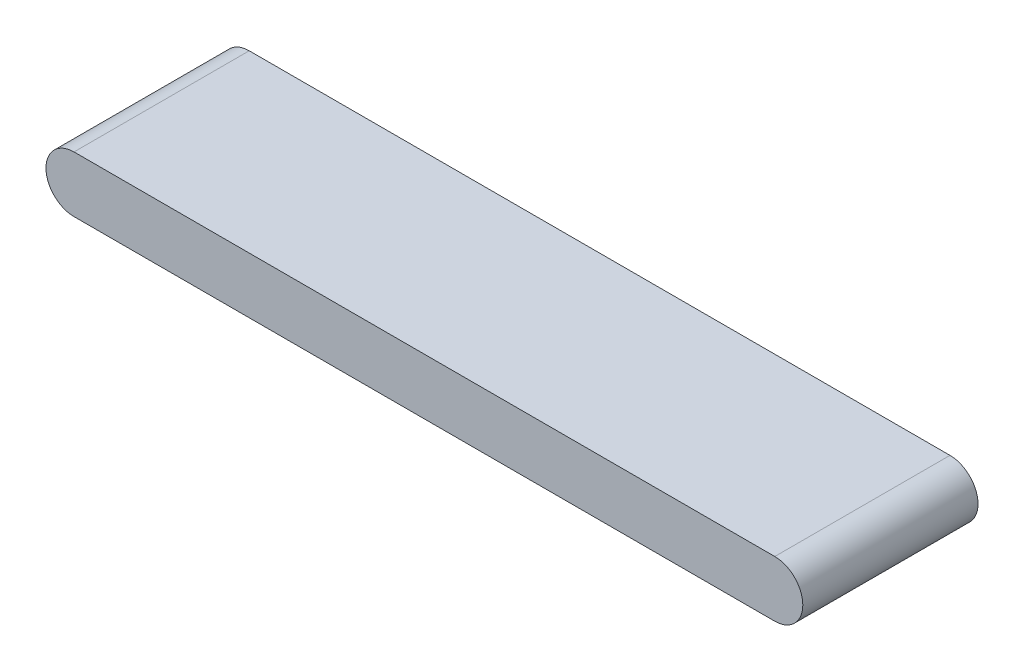
ISO-10303-21;
HEADER;
FILE_DESCRIPTION(('STEP AP214'),'2;1');
FILE_NAME('part.step','',(''),(''),'','','');
FILE_SCHEMA(('AUTOMOTIVE_DESIGN { 1 0 10303 214 1 1 1 1 }'));
ENDSEC;
DATA;
#1=APPLICATION_CONTEXT('core data for automotive mechanical design processes');
#2=APPLICATION_PROTOCOL_DEFINITION('international standard','automotive_design',2000,#1);
#3=PRODUCT_CONTEXT('',#1,'mechanical');
#4=PRODUCT('Part','Part','',(#3));
#5=PRODUCT_RELATED_PRODUCT_CATEGORY('part','',(#4));
#6=PRODUCT_DEFINITION_FORMATION('','',#4);
#7=PRODUCT_DEFINITION_CONTEXT('part definition',#1,'design');
#8=PRODUCT_DEFINITION('design','',#6,#7);
#9=PRODUCT_DEFINITION_SHAPE('','',#8);
#10=(LENGTH_UNIT() NAMED_UNIT(*) SI_UNIT(.MILLI.,.METRE.));
#11=(NAMED_UNIT(*) PLANE_ANGLE_UNIT() SI_UNIT($,.RADIAN.));
#12=(NAMED_UNIT(*) SI_UNIT($,.STERADIAN.) SOLID_ANGLE_UNIT());
#13=UNCERTAINTY_MEASURE_WITH_UNIT(LENGTH_MEASURE(1.E-05),#10,'distance_accuracy_value','');
#14=(GEOMETRIC_REPRESENTATION_CONTEXT(3) GLOBAL_UNCERTAINTY_ASSIGNED_CONTEXT((#13)) GLOBAL_UNIT_ASSIGNED_CONTEXT((#10,
#11,#12)) REPRESENTATION_CONTEXT('',''));
#15=CARTESIAN_POINT('',(0.,0.,0.));
#16=DIRECTION('',(0.,0.,1.));
#17=DIRECTION('',(1.,0.,0.));
#18=AXIS2_PLACEMENT_3D('',#15,#16,#17);
#19=CARTESIAN_POINT('',(-1000.,0.,250.));
#20=DIRECTION('',(0.,0.,-1.));
#21=DIRECTION('',(-1.,0.,0.));
#22=AXIS2_PLACEMENT_3D('',#19,#20,#21);
#23=CYLINDRICAL_SURFACE('',#22,80.0000000000002);
#24=CARTESIAN_POINT('',(-1000.,0.,-250.));
#25=DIRECTION('',(0.,0.,1.));
#26=DIRECTION('',(1.,0.,0.));
#27=AXIS2_PLACEMENT_3D('',#24,#25,#26);
#28=CIRCLE('',#27,80.0000000000002);
#29=CARTESIAN_POINT('',(-1000.,80.0000000000002,-250.));
#30=VERTEX_POINT('',#29);
#31=CARTESIAN_POINT('',(-1000.,-80.0000000000002,-250.));
#32=VERTEX_POINT('',#31);
#33=EDGE_CURVE('E99',#30,#32,#28,.T.);
#34=ORIENTED_EDGE('',*,*,#33,.T.);
#35=DIRECTION('',(0.,0.,-1.));
#36=VECTOR('',#35,1.);
#37=CARTESIAN_POINT('',(-1000.,-80.0000000000002,250.));
#38=LINE('',#37,#36);
#39=CARTESIAN_POINT('',(-1000.,-80.0000000000002,250.));
#40=VERTEX_POINT('',#39);
#41=EDGE_CURVE('E11',#40,#32,#38,.T.);
#42=ORIENTED_EDGE('',*,*,#41,.F.);
#43=CARTESIAN_POINT('',(-1000.,0.,250.));
#44=DIRECTION('',(0.,0.,1.));
#45=DIRECTION('',(1.,0.,0.));
#46=AXIS2_PLACEMENT_3D('',#43,#44,#45);
#47=CIRCLE('',#46,80.0000000000002);
#48=CARTESIAN_POINT('',(-1000.,80.0000000000002,250.));
#49=VERTEX_POINT('',#48);
#50=EDGE_CURVE('E87',#49,#40,#47,.T.);
#51=ORIENTED_EDGE('',*,*,#50,.F.);
#52=DIRECTION('',(0.,0.,-1.));
#53=VECTOR('',#52,1.);
#54=CARTESIAN_POINT('',(-1000.,80.0000000000002,250.));
#55=LINE('',#54,#53);
#56=EDGE_CURVE('E95',#49,#30,#55,.T.);
#57=ORIENTED_EDGE('',*,*,#56,.T.);
#58=EDGE_LOOP('',(#34,#42,#51,#57));
#59=FACE_BOUND('',#58,.T.);
#60=ADVANCED_FACE('F36',(#59),#23,.T.);
#61=CARTESIAN_POINT('',(-1000.,-80.0000000000002,250.));
#62=DIRECTION('',(0.,1.,0.));
#63=DIRECTION('',(0.,0.,1.));
#64=AXIS2_PLACEMENT_3D('',#61,#62,#63);
#65=PLANE('',#64);
#66=DIRECTION('',(1.,0.,0.));
#67=VECTOR('',#66,1.);
#68=CARTESIAN_POINT('',(-1000.,-80.0000000000002,-250.));
#69=LINE('',#68,#67);
#70=CARTESIAN_POINT('',(1000.,-80.0000000000002,-250.));
#71=VERTEX_POINT('',#70);
#72=EDGE_CURVE('E91',#32,#71,#69,.T.);
#73=ORIENTED_EDGE('',*,*,#72,.T.);
#74=DIRECTION('',(0.,0.,-1.));
#75=VECTOR('',#74,1.);
#76=CARTESIAN_POINT('',(1000.,-80.0000000000002,250.));
#77=LINE('',#76,#75);
#78=CARTESIAN_POINT('',(1000.,-80.0000000000002,250.));
#79=VERTEX_POINT('',#78);
#80=EDGE_CURVE('E44',#79,#71,#77,.T.);
#81=ORIENTED_EDGE('',*,*,#80,.F.);
#82=DIRECTION('',(1.,0.,0.));
#83=VECTOR('',#82,1.);
#84=CARTESIAN_POINT('',(-1000.,-80.0000000000002,250.));
#85=LINE('',#84,#83);
#86=EDGE_CURVE('E82',#40,#79,#85,.T.);
#87=ORIENTED_EDGE('',*,*,#86,.F.);
#88=ORIENTED_EDGE('',*,*,#41,.T.);
#89=EDGE_LOOP('',(#73,#81,#87,#88));
#90=FACE_BOUND('',#89,.T.);
#91=ADVANCED_FACE('F90',(#90),#65,.F.);
#92=CARTESIAN_POINT('',(1000.,0.,250.));
#93=DIRECTION('',(0.,0.,-1.));
#94=DIRECTION('',(-1.,0.,0.));
#95=AXIS2_PLACEMENT_3D('',#92,#93,#94);
#96=CYLINDRICAL_SURFACE('',#95,80.0000000000002);
#97=CARTESIAN_POINT('',(1000.,0.,-250.));
#98=DIRECTION('',(0.,0.,1.));
#99=DIRECTION('',(1.,0.,0.));
#100=AXIS2_PLACEMENT_3D('',#97,#98,#99);
#101=CIRCLE('',#100,80.0000000000002);
#102=CARTESIAN_POINT('',(1000.,80.0000000000002,-250.));
#103=VERTEX_POINT('',#102);
#104=EDGE_CURVE('E69',#71,#103,#101,.T.);
#105=ORIENTED_EDGE('',*,*,#104,.T.);
#106=DIRECTION('',(0.,0.,-1.));
#107=VECTOR('',#106,1.);
#108=CARTESIAN_POINT('',(1000.,80.0000000000002,250.));
#109=LINE('',#108,#107);
#110=CARTESIAN_POINT('',(1000.,80.0000000000002,250.));
#111=VERTEX_POINT('',#110);
#112=EDGE_CURVE('E92',#111,#103,#109,.T.);
#113=ORIENTED_EDGE('',*,*,#112,.F.);
#114=CARTESIAN_POINT('',(1000.,0.,250.));
#115=DIRECTION('',(0.,0.,1.));
#116=DIRECTION('',(1.,0.,0.));
#117=AXIS2_PLACEMENT_3D('',#114,#115,#116);
#118=CIRCLE('',#117,80.0000000000002);
#119=EDGE_CURVE('E85',#79,#111,#118,.T.);
#120=ORIENTED_EDGE('',*,*,#119,.F.);
#121=ORIENTED_EDGE('',*,*,#80,.T.);
#122=EDGE_LOOP('',(#105,#113,#120,#121));
#123=FACE_BOUND('',#122,.T.);
#124=ADVANCED_FACE('F93',(#123),#96,.T.);
#125=CARTESIAN_POINT('',(-1000.,80.0000000000002,250.));
#126=DIRECTION('',(0.,-1.,0.));
#127=DIRECTION('',(0.,0.,-1.));
#128=AXIS2_PLACEMENT_3D('',#125,#126,#127);
#129=PLANE('',#128);
#130=DIRECTION('',(-1.,0.,0.));
#131=VECTOR('',#130,1.);
#132=CARTESIAN_POINT('',(-1000.,80.0000000000002,-250.));
#133=LINE('',#132,#131);
#134=EDGE_CURVE('E75',#103,#30,#133,.T.);
#135=ORIENTED_EDGE('',*,*,#134,.T.);
#136=ORIENTED_EDGE('',*,*,#56,.F.);
#137=DIRECTION('',(-1.,0.,0.));
#138=VECTOR('',#137,1.);
#139=CARTESIAN_POINT('',(-1000.,80.0000000000002,250.));
#140=LINE('',#139,#138);
#141=EDGE_CURVE('E52',#111,#49,#140,.T.);
#142=ORIENTED_EDGE('',*,*,#141,.F.);
#143=ORIENTED_EDGE('',*,*,#112,.T.);
#144=EDGE_LOOP('',(#135,#136,#142,#143));
#145=FACE_BOUND('',#144,.T.);
#146=ADVANCED_FACE('F106',(#145),#129,.F.);
#147=CARTESIAN_POINT('',(-1000.,0.,250.));
#148=DIRECTION('',(0.,0.,1.));
#149=DIRECTION('',(1.,0.,0.));
#150=AXIS2_PLACEMENT_3D('',#147,#148,#149);
#151=PLANE('',#150);
#152=ORIENTED_EDGE('',*,*,#50,.T.);
#153=ORIENTED_EDGE('',*,*,#86,.T.);
#154=ORIENTED_EDGE('',*,*,#119,.T.);
#155=ORIENTED_EDGE('',*,*,#141,.T.);
#156=EDGE_LOOP('',(#152,#153,#154,#155));
#157=FACE_BOUND('',#156,.T.);
#158=ADVANCED_FACE('F83',(#157),#151,.T.);
#159=CARTESIAN_POINT('',(-1000.,0.,-250.));
#160=DIRECTION('',(0.,0.,1.));
#161=DIRECTION('',(1.,0.,0.));
#162=AXIS2_PLACEMENT_3D('',#159,#160,#161);
#163=PLANE('',#162);
#164=ORIENTED_EDGE('',*,*,#33,.F.);
#165=ORIENTED_EDGE('',*,*,#134,.F.);
#166=ORIENTED_EDGE('',*,*,#104,.F.);
#167=ORIENTED_EDGE('',*,*,#72,.F.);
#168=EDGE_LOOP('',(#164,#165,#166,#167));
#169=FACE_BOUND('',#168,.T.);
#170=ADVANCED_FACE('F109',(#169),#163,.F.);
#171=CLOSED_SHELL('',(#60,#91,#124,#146,#158,#170));
#172=MANIFOLD_SOLID_BREP('B2',#171);
#173=ADVANCED_BREP_SHAPE_REPRESENTATION('',(#18,#172),#14);
#174=SHAPE_DEFINITION_REPRESENTATION(#9,#173);
ENDSEC;
END-ISO-10303-21;
